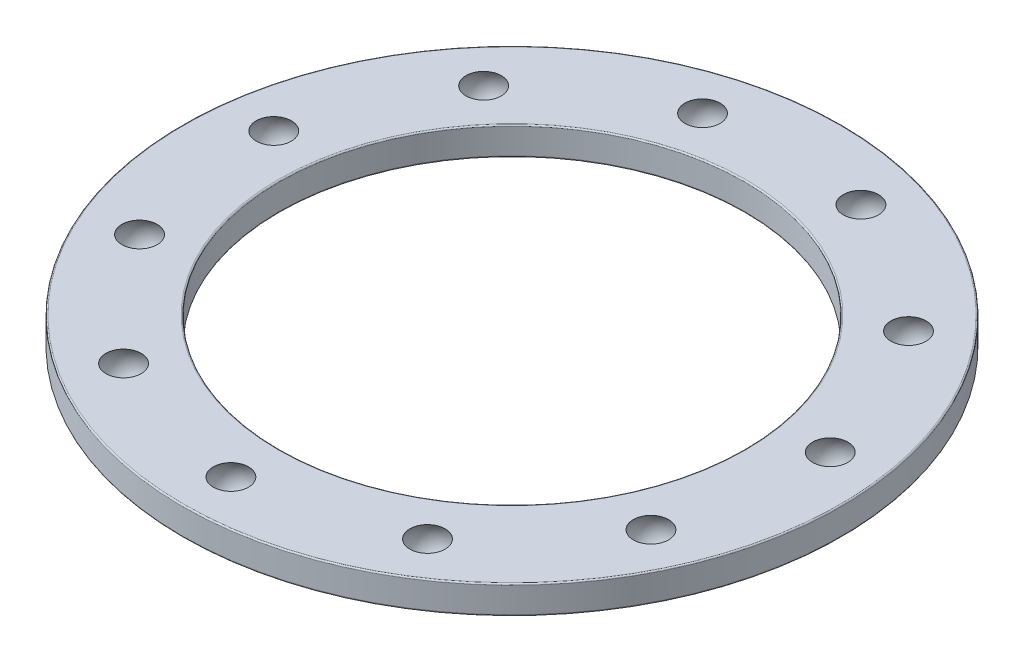
ISO-10303-21;
HEADER;
FILE_DESCRIPTION(('STEP AP214'),'2;1');
FILE_NAME('part.step','',(''),(''),'','','');
FILE_SCHEMA(('AUTOMOTIVE_DESIGN { 1 0 10303 214 1 1 1 1 }'));
ENDSEC;
DATA;
#1=APPLICATION_CONTEXT('core data for automotive mechanical design processes');
#2=APPLICATION_PROTOCOL_DEFINITION('international standard','automotive_design',2000,#1);
#3=PRODUCT_CONTEXT('',#1,'mechanical');
#4=PRODUCT('Part','Part','',(#3));
#5=PRODUCT_RELATED_PRODUCT_CATEGORY('part','',(#4));
#6=PRODUCT_DEFINITION_FORMATION('','',#4);
#7=PRODUCT_DEFINITION_CONTEXT('part definition',#1,'design');
#8=PRODUCT_DEFINITION('design','',#6,#7);
#9=PRODUCT_DEFINITION_SHAPE('','',#8);
#10=(LENGTH_UNIT() NAMED_UNIT(*) SI_UNIT(.MILLI.,.METRE.));
#11=(NAMED_UNIT(*) PLANE_ANGLE_UNIT() SI_UNIT($,.RADIAN.));
#12=(NAMED_UNIT(*) SI_UNIT($,.STERADIAN.) SOLID_ANGLE_UNIT());
#13=UNCERTAINTY_MEASURE_WITH_UNIT(LENGTH_MEASURE(1.E-05),#10,'distance_accuracy_value','');
#14=(GEOMETRIC_REPRESENTATION_CONTEXT(3) GLOBAL_UNCERTAINTY_ASSIGNED_CONTEXT((#13)) GLOBAL_UNIT_ASSIGNED_CONTEXT((#10,
#11,#12)) REPRESENTATION_CONTEXT('',''));
#15=CARTESIAN_POINT('',(0.,0.,0.));
#16=DIRECTION('',(0.,0.,1.));
#17=DIRECTION('',(1.,0.,0.));
#18=AXIS2_PLACEMENT_3D('',#15,#16,#17);
#19=CARTESIAN_POINT('',(0.,1.04523116666666,0.));
#20=DIRECTION('',(0.,-1.,0.));
#21=DIRECTION('',(1.,0.,0.));
#22=AXIS2_PLACEMENT_3D('',#19,#20,#21);
#23=TOROIDAL_SURFACE('',#22,19.160998,0.110998);
#24=CARTESIAN_POINT('',(0.,1.15622916666666,0.));
#25=DIRECTION('',(0.,-1.,0.));
#26=DIRECTION('',(1.,0.,0.));
#27=AXIS2_PLACEMENT_3D('',#24,#25,#26);
#28=CIRCLE('',#27,19.160998);
#29=CARTESIAN_POINT('',(19.160998,1.15622916666666,0.));
#30=VERTEX_POINT('',#29);
#31=EDGE_CURVE('E19',#30,#30,#28,.T.);
#32=ORIENTED_EDGE('',*,*,#31,.F.);
#33=EDGE_LOOP('',(#32));
#34=FACE_BOUND('',#33,.T.);
#35=CARTESIAN_POINT('',(0.,1.04523116666666,0.));
#36=DIRECTION('',(0.,-1.,0.));
#37=DIRECTION('',(0.,0.,-1.));
#38=AXIS2_PLACEMENT_3D('',#35,#36,#37);
#39=CIRCLE('',#38,19.05);
#40=CARTESIAN_POINT('',(0.,1.04523116666666,-19.05));
#41=VERTEX_POINT('',#40);
#42=EDGE_CURVE('E31',#41,#41,#39,.T.);
#43=ORIENTED_EDGE('',*,*,#42,.T.);
#44=EDGE_LOOP('',(#43));
#45=FACE_BOUND('',#44,.T.);
#46=ADVANCED_FACE('F15',(#34,#45),#23,.T.);
#47=CARTESIAN_POINT('',(0.,1.04523116666667,0.));
#48=DIRECTION('',(0.,-1.,0.));
#49=DIRECTION('',(0.,0.,-1.));
#50=AXIS2_PLACEMENT_3D('',#47,#48,#49);
#51=TOROIDAL_SURFACE('',#50,26.876502,0.110997999999996);
#52=CARTESIAN_POINT('',(0.,1.04523116666666,0.));
#53=DIRECTION('',(0.,-1.,0.));
#54=DIRECTION('',(0.,0.,-1.));
#55=AXIS2_PLACEMENT_3D('',#52,#53,#54);
#56=CIRCLE('',#55,26.9875);
#57=CARTESIAN_POINT('',(0.,1.04523116666666,-26.9875));
#58=VERTEX_POINT('',#57);
#59=EDGE_CURVE('E100',#58,#58,#56,.T.);
#60=ORIENTED_EDGE('',*,*,#59,.F.);
#61=EDGE_LOOP('',(#60));
#62=FACE_BOUND('',#61,.T.);
#63=CARTESIAN_POINT('',(0.,1.15622916666666,0.));
#64=DIRECTION('',(0.,-1.,0.));
#65=DIRECTION('',(0.,0.,-1.));
#66=AXIS2_PLACEMENT_3D('',#63,#64,#65);
#67=CIRCLE('',#66,26.876502);
#68=CARTESIAN_POINT('',(0.,1.15622916666666,-26.876502));
#69=VERTEX_POINT('',#68);
#70=EDGE_CURVE('E101',#69,#69,#67,.F.);
#71=ORIENTED_EDGE('',*,*,#70,.F.);
#72=EDGE_LOOP('',(#71));
#73=FACE_BOUND('',#72,.T.);
#74=ADVANCED_FACE('F114',(#62,#73),#51,.T.);
#75=CARTESIAN_POINT('',(0.,1.15622916666666,26.9875));
#76=DIRECTION('',(0.,1.,0.));
#77=DIRECTION('',(0.,0.,1.));
#78=AXIS2_PLACEMENT_3D('',#75,#76,#77);
#79=PLANE('',#78);
#80=ORIENTED_EDGE('',*,*,#70,.T.);
#81=EDGE_LOOP('',(#80));
#82=FACE_BOUND('',#81,.T.);
#83=ORIENTED_EDGE('',*,*,#31,.T.);
#84=EDGE_LOOP('',(#83));
#85=FACE_BOUND('',#84,.T.);
#86=CARTESIAN_POINT('',(-12.4448758168058,1.15622916666666,19.3646047588579));
#87=DIRECTION('',(0.,1.,0.));
#88=DIRECTION('',(0.,0.,1.));
#89=AXIS2_PLACEMENT_3D('',#86,#87,#88);
#90=CIRCLE('',#89,1.44412976630464);
#91=CARTESIAN_POINT('',(-12.4448758168058,1.15622916666666,20.8087345251625));
#92=VERTEX_POINT('',#91);
#93=EDGE_CURVE('E67',#92,#92,#90,.F.);
#94=ORIENTED_EDGE('',*,*,#93,.T.);
#95=EDGE_LOOP('',(#94));
#96=FACE_BOUND('',#95,.T.);
#97=CARTESIAN_POINT('',(-20.9385914930667,1.15622916666666,9.56233433053741));
#98=DIRECTION('',(0.,1.,0.));
#99=DIRECTION('',(0.,0.,1.));
#100=AXIS2_PLACEMENT_3D('',#97,#98,#99);
#101=CIRCLE('',#100,1.44412976630464);
#102=CARTESIAN_POINT('',(-20.9385914930667,1.15622916666666,11.006464096842));
#103=VERTEX_POINT('',#102);
#104=EDGE_CURVE('E71',#103,#103,#101,.F.);
#105=ORIENTED_EDGE('',*,*,#104,.T.);
#106=EDGE_LOOP('',(#105));
#107=FACE_BOUND('',#106,.T.);
#108=CARTESIAN_POINT('',(-22.7844523152968,1.15622916666666,-3.27590968350296));
#109=DIRECTION('',(0.,1.,0.));
#110=DIRECTION('',(0.,0.,1.));
#111=AXIS2_PLACEMENT_3D('',#108,#109,#110);
#112=CIRCLE('',#111,1.44412976630464);
#113=CARTESIAN_POINT('',(-22.7844523152968,1.15622916666666,-1.83177991719832));
#114=VERTEX_POINT('',#113);
#115=EDGE_CURVE('E74',#114,#114,#112,.F.);
#116=ORIENTED_EDGE('',*,*,#115,.T.);
#117=EDGE_LOOP('',(#116));
#118=FACE_BOUND('',#117,.T.);
#119=CARTESIAN_POINT('',(-17.3964105146672,1.15622916666666,-15.0740755195029));
#120=DIRECTION('',(0.,1.,0.));
#121=DIRECTION('',(0.,0.,1.));
#122=AXIS2_PLACEMENT_3D('',#119,#120,#121);
#123=CIRCLE('',#122,1.44412976630464);
#124=CARTESIAN_POINT('',(-17.3964105146672,1.15622916666666,-13.6299457531982));
#125=VERTEX_POINT('',#124);
#126=EDGE_CURVE('E77',#125,#125,#123,.F.);
#127=ORIENTED_EDGE('',*,*,#126,.T.);
#128=EDGE_LOOP('',(#127));
#129=FACE_BOUND('',#128,.T.);
#130=CARTESIAN_POINT('',(-6.48513129279382,1.15622916666666,-22.0863288863887));
#131=DIRECTION('',(0.,1.,0.));
#132=DIRECTION('',(0.,0.,1.));
#133=AXIS2_PLACEMENT_3D('',#130,#131,#132);
#134=CIRCLE('',#133,1.44412976630464);
#135=CARTESIAN_POINT('',(-6.48513129279382,1.15622916666666,-20.642199120084));
#136=VERTEX_POINT('',#135);
#137=EDGE_CURVE('E80',#136,#136,#134,.F.);
#138=ORIENTED_EDGE('',*,*,#137,.T.);
#139=EDGE_LOOP('',(#138));
#140=FACE_BOUND('',#139,.T.);
#141=CARTESIAN_POINT('',(6.48513129279352,1.15622916666666,-22.0863288863888));
#142=DIRECTION('',(0.,1.,0.));
#143=DIRECTION('',(0.,0.,1.));
#144=AXIS2_PLACEMENT_3D('',#141,#142,#143);
#145=CIRCLE('',#144,1.44412976630464);
#146=CARTESIAN_POINT('',(6.48513129279352,1.15622916666666,-20.6421991200841));
#147=VERTEX_POINT('',#146);
#148=EDGE_CURVE('E83',#147,#147,#145,.F.);
#149=ORIENTED_EDGE('',*,*,#148,.T.);
#150=EDGE_LOOP('',(#149));
#151=FACE_BOUND('',#150,.T.);
#152=CARTESIAN_POINT('',(17.396410514667,1.15622916666666,-15.0740755195031));
#153=DIRECTION('',(0.,1.,0.));
#154=DIRECTION('',(0.,0.,1.));
#155=AXIS2_PLACEMENT_3D('',#152,#153,#154);
#156=CIRCLE('',#155,1.44412976630464);
#157=CARTESIAN_POINT('',(17.396410514667,1.15622916666666,-13.6299457531985));
#158=VERTEX_POINT('',#157);
#159=EDGE_CURVE('E86',#158,#158,#156,.F.);
#160=ORIENTED_EDGE('',*,*,#159,.T.);
#161=EDGE_LOOP('',(#160));
#162=FACE_BOUND('',#161,.T.);
#163=CARTESIAN_POINT('',(22.7844523152967,1.15622916666666,-3.27590968350327));
#164=DIRECTION('',(0.,1.,0.));
#165=DIRECTION('',(0.,0.,1.));
#166=AXIS2_PLACEMENT_3D('',#163,#164,#165);
#167=CIRCLE('',#166,1.44412976630464);
#168=CARTESIAN_POINT('',(22.7844523152967,1.15622916666666,-1.83177991719862));
#169=VERTEX_POINT('',#168);
#170=EDGE_CURVE('E89',#169,#169,#167,.F.);
#171=ORIENTED_EDGE('',*,*,#170,.T.);
#172=EDGE_LOOP('',(#171));
#173=FACE_BOUND('',#172,.T.);
#174=CARTESIAN_POINT('',(20.9385914930668,1.15622916666666,9.56233433053712));
#175=DIRECTION('',(0.,1.,0.));
#176=DIRECTION('',(0.,0.,1.));
#177=AXIS2_PLACEMENT_3D('',#174,#175,#176);
#178=CIRCLE('',#177,1.44412976630464);
#179=CARTESIAN_POINT('',(20.9385914930668,1.15622916666666,11.0064640968418));
#180=VERTEX_POINT('',#179);
#181=EDGE_CURVE('E92',#180,#180,#178,.F.);
#182=ORIENTED_EDGE('',*,*,#181,.T.);
#183=EDGE_LOOP('',(#182));
#184=FACE_BOUND('',#183,.T.);
#185=CARTESIAN_POINT('',(12.4448758168061,1.15622916666666,19.3646047588577));
#186=DIRECTION('',(0.,1.,0.));
#187=DIRECTION('',(0.,0.,1.));
#188=AXIS2_PLACEMENT_3D('',#185,#186,#187);
#189=CIRCLE('',#188,1.44412976630464);
#190=CARTESIAN_POINT('',(12.4448758168061,1.15622916666666,20.8087345251624));
#191=VERTEX_POINT('',#190);
#192=EDGE_CURVE('E95',#191,#191,#189,.F.);
#193=ORIENTED_EDGE('',*,*,#192,.T.);
#194=EDGE_LOOP('',(#193));
#195=FACE_BOUND('',#194,.T.);
#196=CARTESIAN_POINT('',(0.,1.15622916666666,23.01875));
#197=DIRECTION('',(0.,1.,0.));
#198=DIRECTION('',(0.,0.,1.));
#199=AXIS2_PLACEMENT_3D('',#196,#197,#198);
#200=CIRCLE('',#199,1.44412976630464);
#201=CARTESIAN_POINT('',(0.,1.15622916666666,24.4628797663046));
#202=VERTEX_POINT('',#201);
#203=EDGE_CURVE('E98',#202,#202,#200,.F.);
#204=ORIENTED_EDGE('',*,*,#203,.T.);
#205=EDGE_LOOP('',(#204));
#206=FACE_BOUND('',#205,.T.);
#207=ADVANCED_FACE('F109',(#82,#85,#96,#107,#118,#129,#140,#151,#162,#173,#184,#195,#206),#79,.T.);
#208=CARTESIAN_POINT('',(0.,-5.5499,0.));
#209=DIRECTION('',(0.,-1.,0.));
#210=DIRECTION('',(0.,0.,-1.));
#211=AXIS2_PLACEMENT_3D('',#208,#209,#210);
#212=CYLINDRICAL_SURFACE('',#211,19.05);
#213=ORIENTED_EDGE('',*,*,#42,.F.);
#214=EDGE_LOOP('',(#213));
#215=FACE_BOUND('',#214,.T.);
#216=CARTESIAN_POINT('',(0.,-1.04523116666667,0.));
#217=DIRECTION('',(0.,1.,0.));
#218=DIRECTION('',(0.,0.,1.));
#219=AXIS2_PLACEMENT_3D('',#216,#217,#218);
#220=CIRCLE('',#219,19.05);
#221=CARTESIAN_POINT('',(0.,-1.04523116666667,19.05));
#222=VERTEX_POINT('',#221);
#223=EDGE_CURVE('E70',#222,#222,#220,.T.);
#224=ORIENTED_EDGE('',*,*,#223,.F.);
#225=EDGE_LOOP('',(#224));
#226=FACE_BOUND('',#225,.T.);
#227=ADVANCED_FACE('F118',(#215,#226),#212,.F.);
#228=CARTESIAN_POINT('',(0.,-5.5499,0.));
#229=DIRECTION('',(0.,-1.,0.));
#230=DIRECTION('',(0.,0.,-1.));
#231=AXIS2_PLACEMENT_3D('',#228,#229,#230);
#232=CYLINDRICAL_SURFACE('',#231,26.9875);
#233=CARTESIAN_POINT('',(0.,-1.04523116666667,0.));
#234=DIRECTION('',(0.,-1.,0.));
#235=DIRECTION('',(0.,0.,-1.));
#236=AXIS2_PLACEMENT_3D('',#233,#234,#235);
#237=CIRCLE('',#236,26.9875);
#238=CARTESIAN_POINT('',(0.,-1.04523116666667,-26.9875));
#239=VERTEX_POINT('',#238);
#240=EDGE_CURVE('E66',#239,#239,#237,.T.);
#241=ORIENTED_EDGE('',*,*,#240,.F.);
#242=EDGE_LOOP('',(#241));
#243=FACE_BOUND('',#242,.T.);
#244=ORIENTED_EDGE('',*,*,#59,.T.);
#245=EDGE_LOOP('',(#244));
#246=FACE_BOUND('',#245,.T.);
#247=ADVANCED_FACE('F121',(#243,#246),#232,.T.);
#248=CARTESIAN_POINT('',(0.,0.,23.01875));
#249=DIRECTION('',(1.,0.,0.));
#250=DIRECTION('',(0.,1.,0.));
#251=AXIS2_PLACEMENT_3D('',#248,#249,#250);
#252=SPHERICAL_SURFACE('',#251,1.84996666666667);
#253=CARTESIAN_POINT('',(0.,0.,23.01875));
#254=DIRECTION('',(0.,1.,0.));
#255=DIRECTION('',(0.,0.,1.));
#256=AXIS2_PLACEMENT_3D('',#253,#254,#255);
#257=SPHERICAL_SURFACE('',#256,1.84996666666667);
#258=ORIENTED_EDGE('',*,*,#203,.F.);
#259=EDGE_LOOP('',(#258));
#260=FACE_BOUND('',#259,.T.);
#261=CARTESIAN_POINT('',(0.,-1.15622916666667,23.01875));
#262=DIRECTION('',(0.,-1.,0.));
#263=DIRECTION('',(0.,0.,-1.));
#264=AXIS2_PLACEMENT_3D('',#261,#262,#263);
#265=CIRCLE('',#264,1.44412976630463);
#266=CARTESIAN_POINT('',(0.,-1.15622916666667,21.5746202336954));
#267=VERTEX_POINT('',#266);
#268=EDGE_CURVE('E63',#267,#267,#265,.F.);
#269=ORIENTED_EDGE('',*,*,#268,.F.);
#270=EDGE_LOOP('',(#269));
#271=FACE_BOUND('',#270,.T.);
#272=ADVANCED_FACE('F153',(#260,#271),#257,.F.);
#273=CARTESIAN_POINT('',(12.4448758168061,0.,19.3646047588577));
#274=DIRECTION('',(1.,0.,0.));
#275=DIRECTION('',(0.,1.,0.));
#276=AXIS2_PLACEMENT_3D('',#273,#274,#275);
#277=SPHERICAL_SURFACE('',#276,1.84996666666667);
#278=CARTESIAN_POINT('',(12.4448758168061,0.,19.3646047588577));
#279=DIRECTION('',(0.,1.,0.));
#280=DIRECTION('',(0.,0.,1.));
#281=AXIS2_PLACEMENT_3D('',#278,#279,#280);
#282=SPHERICAL_SURFACE('',#281,1.84996666666667);
#283=ORIENTED_EDGE('',*,*,#192,.F.);
#284=EDGE_LOOP('',(#283));
#285=FACE_BOUND('',#284,.T.);
#286=CARTESIAN_POINT('',(12.4448758168061,-1.15622916666667,19.3646047588577));
#287=DIRECTION('',(0.,-1.,0.));
#288=DIRECTION('',(0.,0.,-1.));
#289=AXIS2_PLACEMENT_3D('',#286,#287,#288);
#290=CIRCLE('',#289,1.44412976630463);
#291=CARTESIAN_POINT('',(12.4448758168061,-1.15622916666667,17.9204749925531));
#292=VERTEX_POINT('',#291);
#293=EDGE_CURVE('E60',#292,#292,#290,.F.);
#294=ORIENTED_EDGE('',*,*,#293,.F.);
#295=EDGE_LOOP('',(#294));
#296=FACE_BOUND('',#295,.T.);
#297=ADVANCED_FACE('F158',(#285,#296),#282,.F.);
#298=CARTESIAN_POINT('',(20.9385914930668,0.,9.56233433053712));
#299=DIRECTION('',(1.,0.,0.));
#300=DIRECTION('',(0.,1.,0.));
#301=AXIS2_PLACEMENT_3D('',#298,#299,#300);
#302=SPHERICAL_SURFACE('',#301,1.84996666666667);
#303=CARTESIAN_POINT('',(20.9385914930668,0.,9.56233433053712));
#304=DIRECTION('',(0.,1.,0.));
#305=DIRECTION('',(0.,0.,1.));
#306=AXIS2_PLACEMENT_3D('',#303,#304,#305);
#307=SPHERICAL_SURFACE('',#306,1.84996666666667);
#308=ORIENTED_EDGE('',*,*,#181,.F.);
#309=EDGE_LOOP('',(#308));
#310=FACE_BOUND('',#309,.T.);
#311=CARTESIAN_POINT('',(20.9385914930668,-1.15622916666667,9.56233433053712));
#312=DIRECTION('',(0.,-1.,0.));
#313=DIRECTION('',(0.,0.,-1.));
#314=AXIS2_PLACEMENT_3D('',#311,#312,#313);
#315=CIRCLE('',#314,1.44412976630463);
#316=CARTESIAN_POINT('',(20.9385914930668,-1.15622916666667,8.11820456423249));
#317=VERTEX_POINT('',#316);
#318=EDGE_CURVE('E57',#317,#317,#315,.F.);
#319=ORIENTED_EDGE('',*,*,#318,.F.);
#320=EDGE_LOOP('',(#319));
#321=FACE_BOUND('',#320,.T.);
#322=ADVANCED_FACE('F165',(#310,#321),#307,.F.);
#323=CARTESIAN_POINT('',(22.7844523152967,0.,-3.27590968350327));
#324=DIRECTION('',(1.,0.,0.));
#325=DIRECTION('',(0.,-1.,0.));
#326=AXIS2_PLACEMENT_3D('',#323,#324,#325);
#327=SPHERICAL_SURFACE('',#326,1.84996666666667);
#328=CARTESIAN_POINT('',(22.7844523152967,0.,-3.27590968350327));
#329=DIRECTION('',(0.,-1.,0.));
#330=DIRECTION('',(0.,0.,-1.));
#331=AXIS2_PLACEMENT_3D('',#328,#329,#330);
#332=SPHERICAL_SURFACE('',#331,1.84996666666667);
#333=CARTESIAN_POINT('',(22.7844523152967,-1.15622916666667,-3.27590968350327));
#334=DIRECTION('',(0.,-1.,0.));
#335=DIRECTION('',(0.,0.,-1.));
#336=AXIS2_PLACEMENT_3D('',#333,#334,#335);
#337=CIRCLE('',#336,1.44412976630463);
#338=CARTESIAN_POINT('',(22.7844523152967,-1.15622916666667,-4.7200394498079));
#339=VERTEX_POINT('',#338);
#340=EDGE_CURVE('E54',#339,#339,#337,.F.);
#341=ORIENTED_EDGE('',*,*,#340,.F.);
#342=EDGE_LOOP('',(#341));
#343=FACE_BOUND('',#342,.T.);
#344=ORIENTED_EDGE('',*,*,#170,.F.);
#345=EDGE_LOOP('',(#344));
#346=FACE_BOUND('',#345,.T.);
#347=ADVANCED_FACE('F173',(#343,#346),#332,.F.);
#348=CARTESIAN_POINT('',(17.396410514667,0.,-15.0740755195031));
#349=DIRECTION('',(1.,0.,0.));
#350=DIRECTION('',(0.,-1.,0.));
#351=AXIS2_PLACEMENT_3D('',#348,#349,#350);
#352=SPHERICAL_SURFACE('',#351,1.84996666666667);
#353=CARTESIAN_POINT('',(17.396410514667,0.,-15.0740755195031));
#354=DIRECTION('',(0.,-1.,0.));
#355=DIRECTION('',(0.,0.,-1.));
#356=AXIS2_PLACEMENT_3D('',#353,#354,#355);
#357=SPHERICAL_SURFACE('',#356,1.84996666666667);
#358=CARTESIAN_POINT('',(17.396410514667,-1.15622916666667,-15.0740755195031));
#359=DIRECTION('',(0.,-1.,0.));
#360=DIRECTION('',(0.,0.,-1.));
#361=AXIS2_PLACEMENT_3D('',#358,#359,#360);
#362=CIRCLE('',#361,1.44412976630463);
#363=CARTESIAN_POINT('',(17.396410514667,-1.15622916666667,-16.5182052858077));
#364=VERTEX_POINT('',#363);
#365=EDGE_CURVE('E51',#364,#364,#362,.F.);
#366=ORIENTED_EDGE('',*,*,#365,.F.);
#367=EDGE_LOOP('',(#366));
#368=FACE_BOUND('',#367,.T.);
#369=ORIENTED_EDGE('',*,*,#159,.F.);
#370=EDGE_LOOP('',(#369));
#371=FACE_BOUND('',#370,.T.);
#372=ADVANCED_FACE('F177',(#368,#371),#357,.F.);
#373=CARTESIAN_POINT('',(6.48513129279352,0.,-22.0863288863888));
#374=DIRECTION('',(1.,0.,0.));
#375=DIRECTION('',(0.,-1.,0.));
#376=AXIS2_PLACEMENT_3D('',#373,#374,#375);
#377=SPHERICAL_SURFACE('',#376,1.84996666666667);
#378=CARTESIAN_POINT('',(6.48513129279352,0.,-22.0863288863888));
#379=DIRECTION('',(0.,-1.,0.));
#380=DIRECTION('',(0.,0.,-1.));
#381=AXIS2_PLACEMENT_3D('',#378,#379,#380);
#382=SPHERICAL_SURFACE('',#381,1.84996666666667);
#383=CARTESIAN_POINT('',(6.48513129279352,-1.15622916666667,-22.0863288863888));
#384=DIRECTION('',(0.,-1.,0.));
#385=DIRECTION('',(0.,0.,-1.));
#386=AXIS2_PLACEMENT_3D('',#383,#384,#385);
#387=CIRCLE('',#386,1.44412976630463);
#388=CARTESIAN_POINT('',(6.48513129279352,-1.15622916666667,-23.5304586526934));
#389=VERTEX_POINT('',#388);
#390=EDGE_CURVE('E48',#389,#389,#387,.F.);
#391=ORIENTED_EDGE('',*,*,#390,.F.);
#392=EDGE_LOOP('',(#391));
#393=FACE_BOUND('',#392,.T.);
#394=ORIENTED_EDGE('',*,*,#148,.F.);
#395=EDGE_LOOP('',(#394));
#396=FACE_BOUND('',#395,.T.);
#397=ADVANCED_FACE('F181',(#393,#396),#382,.F.);
#398=CARTESIAN_POINT('',(-6.48513129279382,0.,-22.0863288863887));
#399=DIRECTION('',(1.,0.,0.));
#400=DIRECTION('',(0.,-1.,0.));
#401=AXIS2_PLACEMENT_3D('',#398,#399,#400);
#402=SPHERICAL_SURFACE('',#401,1.84996666666667);
#403=CARTESIAN_POINT('',(-6.48513129279382,0.,-22.0863288863887));
#404=DIRECTION('',(0.,-1.,0.));
#405=DIRECTION('',(0.,0.,-1.));
#406=AXIS2_PLACEMENT_3D('',#403,#404,#405);
#407=SPHERICAL_SURFACE('',#406,1.84996666666667);
#408=CARTESIAN_POINT('',(-6.48513129279382,-1.15622916666667,-22.0863288863887));
#409=DIRECTION('',(0.,-1.,0.));
#410=DIRECTION('',(0.,0.,-1.));
#411=AXIS2_PLACEMENT_3D('',#408,#409,#410);
#412=CIRCLE('',#411,1.44412976630463);
#413=CARTESIAN_POINT('',(-6.48513129279382,-1.15622916666667,-23.5304586526933));
#414=VERTEX_POINT('',#413);
#415=EDGE_CURVE('E45',#414,#414,#412,.F.);
#416=ORIENTED_EDGE('',*,*,#415,.F.);
#417=EDGE_LOOP('',(#416));
#418=FACE_BOUND('',#417,.T.);
#419=ORIENTED_EDGE('',*,*,#137,.F.);
#420=EDGE_LOOP('',(#419));
#421=FACE_BOUND('',#420,.T.);
#422=ADVANCED_FACE('F185',(#418,#421),#407,.F.);
#423=CARTESIAN_POINT('',(-17.3964105146672,0.,-15.0740755195029));
#424=DIRECTION('',(1.,0.,0.));
#425=DIRECTION('',(0.,-1.,0.));
#426=AXIS2_PLACEMENT_3D('',#423,#424,#425);
#427=SPHERICAL_SURFACE('',#426,1.84996666666667);
#428=CARTESIAN_POINT('',(-17.3964105146672,0.,-15.0740755195029));
#429=DIRECTION('',(0.,-1.,0.));
#430=DIRECTION('',(0.,0.,-1.));
#431=AXIS2_PLACEMENT_3D('',#428,#429,#430);
#432=SPHERICAL_SURFACE('',#431,1.84996666666667);
#433=CARTESIAN_POINT('',(-17.3964105146672,-1.15622916666667,-15.0740755195029));
#434=DIRECTION('',(0.,-1.,0.));
#435=DIRECTION('',(0.,0.,-1.));
#436=AXIS2_PLACEMENT_3D('',#433,#434,#435);
#437=CIRCLE('',#436,1.44412976630463);
#438=CARTESIAN_POINT('',(-17.3964105146672,-1.15622916666667,-16.5182052858075));
#439=VERTEX_POINT('',#438);
#440=EDGE_CURVE('E42',#439,#439,#437,.F.);
#441=ORIENTED_EDGE('',*,*,#440,.F.);
#442=EDGE_LOOP('',(#441));
#443=FACE_BOUND('',#442,.T.);
#444=ORIENTED_EDGE('',*,*,#126,.F.);
#445=EDGE_LOOP('',(#444));
#446=FACE_BOUND('',#445,.T.);
#447=ADVANCED_FACE('F189',(#443,#446),#432,.F.);
#448=CARTESIAN_POINT('',(-22.7844523152968,0.,-3.27590968350296));
#449=DIRECTION('',(1.,0.,0.));
#450=DIRECTION('',(0.,-1.,0.));
#451=AXIS2_PLACEMENT_3D('',#448,#449,#450);
#452=SPHERICAL_SURFACE('',#451,1.84996666666667);
#453=CARTESIAN_POINT('',(-22.7844523152968,0.,-3.27590968350296));
#454=DIRECTION('',(0.,-1.,0.));
#455=DIRECTION('',(0.,0.,-1.));
#456=AXIS2_PLACEMENT_3D('',#453,#454,#455);
#457=SPHERICAL_SURFACE('',#456,1.84996666666667);
#458=CARTESIAN_POINT('',(-22.7844523152968,-1.15622916666667,-3.27590968350296));
#459=DIRECTION('',(0.,-1.,0.));
#460=DIRECTION('',(0.,0.,-1.));
#461=AXIS2_PLACEMENT_3D('',#458,#459,#460);
#462=CIRCLE('',#461,1.44412976630463);
#463=CARTESIAN_POINT('',(-22.7844523152968,-1.15622916666667,-4.7200394498076));
#464=VERTEX_POINT('',#463);
#465=EDGE_CURVE('E39',#464,#464,#462,.F.);
#466=ORIENTED_EDGE('',*,*,#465,.F.);
#467=EDGE_LOOP('',(#466));
#468=FACE_BOUND('',#467,.T.);
#469=ORIENTED_EDGE('',*,*,#115,.F.);
#470=EDGE_LOOP('',(#469));
#471=FACE_BOUND('',#470,.T.);
#472=ADVANCED_FACE('F193',(#468,#471),#457,.F.);
#473=CARTESIAN_POINT('',(-20.9385914930667,0.,9.56233433053741));
#474=DIRECTION('',(1.,0.,0.));
#475=DIRECTION('',(0.,1.,0.));
#476=AXIS2_PLACEMENT_3D('',#473,#474,#475);
#477=SPHERICAL_SURFACE('',#476,1.84996666666667);
#478=CARTESIAN_POINT('',(-20.9385914930667,0.,9.56233433053741));
#479=DIRECTION('',(0.,1.,0.));
#480=DIRECTION('',(0.,0.,1.));
#481=AXIS2_PLACEMENT_3D('',#478,#479,#480);
#482=SPHERICAL_SURFACE('',#481,1.84996666666667);
#483=ORIENTED_EDGE('',*,*,#104,.F.);
#484=EDGE_LOOP('',(#483));
#485=FACE_BOUND('',#484,.T.);
#486=CARTESIAN_POINT('',(-20.9385914930667,-1.15622916666667,9.56233433053741));
#487=DIRECTION('',(0.,-1.,0.));
#488=DIRECTION('',(0.,0.,-1.));
#489=AXIS2_PLACEMENT_3D('',#486,#487,#488);
#490=CIRCLE('',#489,1.44412976630463);
#491=CARTESIAN_POINT('',(-20.9385914930667,-1.15622916666667,8.11820456423277));
#492=VERTEX_POINT('',#491);
#493=EDGE_CURVE('E36',#492,#492,#490,.F.);
#494=ORIENTED_EDGE('',*,*,#493,.F.);
#495=EDGE_LOOP('',(#494));
#496=FACE_BOUND('',#495,.T.);
#497=ADVANCED_FACE('F197',(#485,#496),#482,.F.);
#498=CARTESIAN_POINT('',(-12.4448758168058,0.,19.3646047588579));
#499=DIRECTION('',(1.,0.,0.));
#500=DIRECTION('',(0.,1.,0.));
#501=AXIS2_PLACEMENT_3D('',#498,#499,#500);
#502=SPHERICAL_SURFACE('',#501,1.84996666666667);
#503=CARTESIAN_POINT('',(-12.4448758168058,0.,19.3646047588579));
#504=DIRECTION('',(0.,1.,0.));
#505=DIRECTION('',(0.,0.,1.));
#506=AXIS2_PLACEMENT_3D('',#503,#504,#505);
#507=SPHERICAL_SURFACE('',#506,1.84996666666667);
#508=ORIENTED_EDGE('',*,*,#93,.F.);
#509=EDGE_LOOP('',(#508));
#510=FACE_BOUND('',#509,.T.);
#511=CARTESIAN_POINT('',(-12.4448758168058,-1.15622916666667,19.3646047588579));
#512=DIRECTION('',(0.,-1.,0.));
#513=DIRECTION('',(0.,0.,-1.));
#514=AXIS2_PLACEMENT_3D('',#511,#512,#513);
#515=CIRCLE('',#514,1.44412976630463);
#516=CARTESIAN_POINT('',(-12.4448758168058,-1.15622916666667,17.9204749925533));
#517=VERTEX_POINT('',#516);
#518=EDGE_CURVE('E28',#517,#517,#515,.F.);
#519=ORIENTED_EDGE('',*,*,#518,.F.);
#520=EDGE_LOOP('',(#519));
#521=FACE_BOUND('',#520,.T.);
#522=ADVANCED_FACE('F201',(#510,#521),#507,.F.);
#523=CARTESIAN_POINT('',(0.,-1.04523116666667,0.));
#524=DIRECTION('',(0.,1.,0.));
#525=DIRECTION('',(0.,0.,1.));
#526=AXIS2_PLACEMENT_3D('',#523,#524,#525);
#527=TOROIDAL_SURFACE('',#526,19.160998,0.110998);
#528=ORIENTED_EDGE('',*,*,#223,.T.);
#529=EDGE_LOOP('',(#528));
#530=FACE_BOUND('',#529,.T.);
#531=CARTESIAN_POINT('',(0.,-1.15622916666667,0.));
#532=DIRECTION('',(0.,1.,0.));
#533=DIRECTION('',(0.,0.,1.));
#534=AXIS2_PLACEMENT_3D('',#531,#532,#533);
#535=CIRCLE('',#534,19.160998);
#536=CARTESIAN_POINT('',(0.,-1.15622916666667,19.160998));
#537=VERTEX_POINT('',#536);
#538=EDGE_CURVE('E23',#537,#537,#535,.T.);
#539=ORIENTED_EDGE('',*,*,#538,.F.);
#540=EDGE_LOOP('',(#539));
#541=FACE_BOUND('',#540,.T.);
#542=ADVANCED_FACE('F148',(#530,#541),#527,.T.);
#543=CARTESIAN_POINT('',(0.,-1.04523116666668,0.));
#544=DIRECTION('',(0.,1.,0.));
#545=DIRECTION('',(0.,0.,1.));
#546=AXIS2_PLACEMENT_3D('',#543,#544,#545);
#547=TOROIDAL_SURFACE('',#546,26.876502,0.110997999999996);
#548=ORIENTED_EDGE('',*,*,#240,.T.);
#549=EDGE_LOOP('',(#548));
#550=FACE_BOUND('',#549,.T.);
#551=CARTESIAN_POINT('',(0.,-1.15622916666667,0.));
#552=DIRECTION('',(0.,1.,0.));
#553=DIRECTION('',(0.,0.,1.));
#554=AXIS2_PLACEMENT_3D('',#551,#552,#553);
#555=CIRCLE('',#554,26.876502);
#556=CARTESIAN_POINT('',(0.,-1.15622916666667,26.876502));
#557=VERTEX_POINT('',#556);
#558=EDGE_CURVE('E10',#557,#557,#555,.F.);
#559=ORIENTED_EDGE('',*,*,#558,.F.);
#560=EDGE_LOOP('',(#559));
#561=FACE_BOUND('',#560,.T.);
#562=ADVANCED_FACE('F17',(#550,#561),#547,.T.);
#563=CARTESIAN_POINT('',(0.,-1.15622916666667,26.9875));
#564=DIRECTION('',(0.,-1.,0.));
#565=DIRECTION('',(0.,0.,-1.));
#566=AXIS2_PLACEMENT_3D('',#563,#564,#565);
#567=PLANE('',#566);
#568=ORIENTED_EDGE('',*,*,#558,.T.);
#569=EDGE_LOOP('',(#568));
#570=FACE_BOUND('',#569,.T.);
#571=ORIENTED_EDGE('',*,*,#538,.T.);
#572=EDGE_LOOP('',(#571));
#573=FACE_BOUND('',#572,.T.);
#574=ORIENTED_EDGE('',*,*,#518,.T.);
#575=EDGE_LOOP('',(#574));
#576=FACE_BOUND('',#575,.T.);
#577=ORIENTED_EDGE('',*,*,#493,.T.);
#578=EDGE_LOOP('',(#577));
#579=FACE_BOUND('',#578,.T.);
#580=ORIENTED_EDGE('',*,*,#465,.T.);
#581=EDGE_LOOP('',(#580));
#582=FACE_BOUND('',#581,.T.);
#583=ORIENTED_EDGE('',*,*,#440,.T.);
#584=EDGE_LOOP('',(#583));
#585=FACE_BOUND('',#584,.T.);
#586=ORIENTED_EDGE('',*,*,#415,.T.);
#587=EDGE_LOOP('',(#586));
#588=FACE_BOUND('',#587,.T.);
#589=ORIENTED_EDGE('',*,*,#390,.T.);
#590=EDGE_LOOP('',(#589));
#591=FACE_BOUND('',#590,.T.);
#592=ORIENTED_EDGE('',*,*,#365,.T.);
#593=EDGE_LOOP('',(#592));
#594=FACE_BOUND('',#593,.T.);
#595=ORIENTED_EDGE('',*,*,#340,.T.);
#596=EDGE_LOOP('',(#595));
#597=FACE_BOUND('',#596,.T.);
#598=ORIENTED_EDGE('',*,*,#318,.T.);
#599=EDGE_LOOP('',(#598));
#600=FACE_BOUND('',#599,.T.);
#601=ORIENTED_EDGE('',*,*,#293,.T.);
#602=EDGE_LOOP('',(#601));
#603=FACE_BOUND('',#602,.T.);
#604=ORIENTED_EDGE('',*,*,#268,.T.);
#605=EDGE_LOOP('',(#604));
#606=FACE_BOUND('',#605,.T.);
#607=ADVANCED_FACE('F142',(#570,#573,#576,#579,#582,#585,#588,#591,#594,#597,#600,#603,#606),
#567,.T.);
#608=CLOSED_SHELL('',(#46,#74,#207,#227,#247,#272,#297,#322,#347,#372,#397,#422,#447,#472,#497,
#522,#542,#562,#607));
#609=MANIFOLD_SOLID_BREP('B1',#608);
#610=ADVANCED_BREP_SHAPE_REPRESENTATION('',(#18,#609),#14);
#611=SHAPE_DEFINITION_REPRESENTATION(#9,#610);
ENDSEC;
END-ISO-10303-21;
